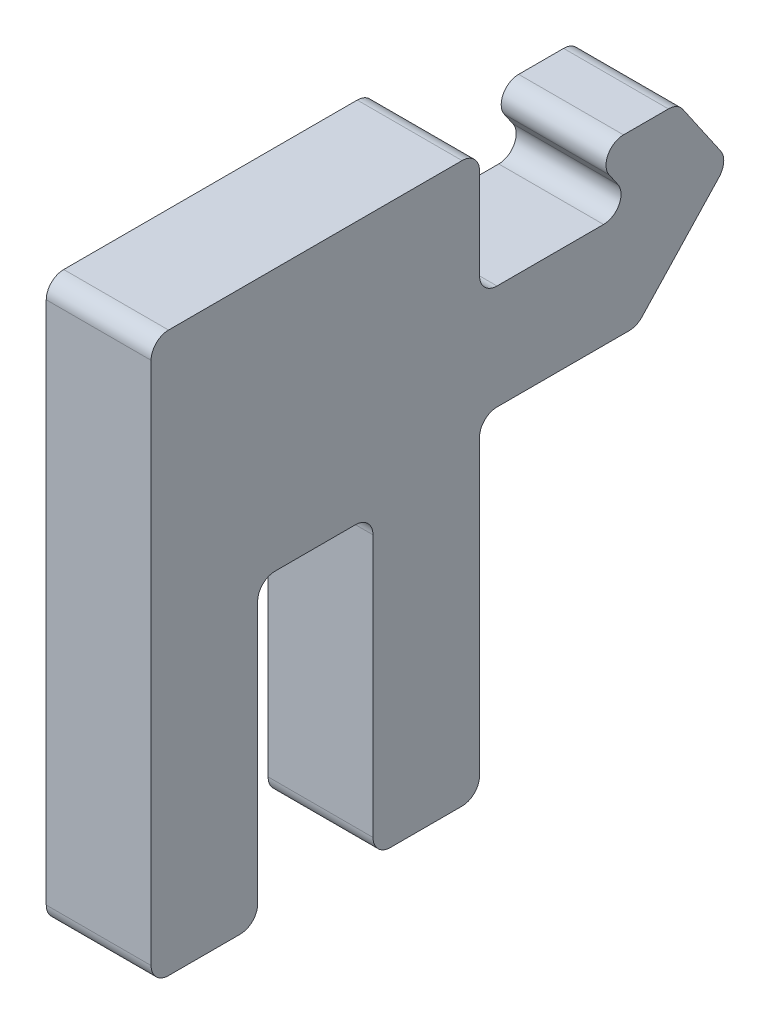
ISO-10303-21;
HEADER;
FILE_DESCRIPTION(('STEP AP214'),'2;1');
FILE_NAME('part.step','',(''),(''),'','','');
FILE_SCHEMA(('AUTOMOTIVE_DESIGN { 1 0 10303 214 1 1 1 1 }'));
ENDSEC;
DATA;
#1=APPLICATION_CONTEXT('core data for automotive mechanical design processes');
#2=APPLICATION_PROTOCOL_DEFINITION('international standard','automotive_design',2000,#1);
#3=PRODUCT_CONTEXT('',#1,'mechanical');
#4=PRODUCT('Part','Part','',(#3));
#5=PRODUCT_RELATED_PRODUCT_CATEGORY('part','',(#4));
#6=PRODUCT_DEFINITION_FORMATION('','',#4);
#7=PRODUCT_DEFINITION_CONTEXT('part definition',#1,'design');
#8=PRODUCT_DEFINITION('design','',#6,#7);
#9=PRODUCT_DEFINITION_SHAPE('','',#8);
#10=(LENGTH_UNIT() NAMED_UNIT(*) SI_UNIT(.MILLI.,.METRE.));
#11=(NAMED_UNIT(*) PLANE_ANGLE_UNIT() SI_UNIT($,.RADIAN.));
#12=(NAMED_UNIT(*) SI_UNIT($,.STERADIAN.) SOLID_ANGLE_UNIT());
#13=UNCERTAINTY_MEASURE_WITH_UNIT(LENGTH_MEASURE(1.E-05),#10,'distance_accuracy_value','');
#14=(GEOMETRIC_REPRESENTATION_CONTEXT(3) GLOBAL_UNCERTAINTY_ASSIGNED_CONTEXT((#13)) GLOBAL_UNIT_ASSIGNED_CONTEXT((#10,
#11,#12)) REPRESENTATION_CONTEXT('',''));
#15=CARTESIAN_POINT('',(0.,0.,0.));
#16=DIRECTION('',(0.,0.,1.));
#17=DIRECTION('',(1.,0.,0.));
#18=AXIS2_PLACEMENT_3D('',#15,#16,#17);
#19=CARTESIAN_POINT('',(3.,8.,-4.7));
#20=DIRECTION('',(0.,0.,1.));
#21=DIRECTION('',(0.,-1.,0.));
#22=AXIS2_PLACEMENT_3D('',#19,#20,#21);
#23=PLANE('',#22);
#24=DIRECTION('',(0.,1.,0.));
#25=VECTOR('',#24,1.);
#26=CARTESIAN_POINT('',(3.,8.,-4.7));
#27=LINE('',#26,#25);
#28=CARTESIAN_POINT('',(3.,4.89179828626601,-4.7));
#29=VERTEX_POINT('',#28);
#30=CARTESIAN_POINT('',(3.,7.5,-4.7));
#31=VERTEX_POINT('',#30);
#32=EDGE_CURVE('E430',#29,#31,#27,.T.);
#33=ORIENTED_EDGE('',*,*,#32,.F.);
#34=DIRECTION('',(1.,0.,0.));
#35=VECTOR('',#34,1.);
#36=CARTESIAN_POINT('',(3.,4.89179828626601,-4.7));
#37=LINE('',#36,#35);
#38=CARTESIAN_POINT('',(0.,4.89179828626601,-4.7));
#39=VERTEX_POINT('',#38);
#40=EDGE_CURVE('E322',#29,#39,#37,.F.);
#41=ORIENTED_EDGE('',*,*,#40,.T.);
#42=DIRECTION('',(0.,1.,0.));
#43=VECTOR('',#42,1.);
#44=CARTESIAN_POINT('',(0.,8.,-4.7));
#45=LINE('',#44,#43);
#46=CARTESIAN_POINT('',(0.,7.5,-4.7));
#47=VERTEX_POINT('',#46);
#48=EDGE_CURVE('E440',#39,#47,#45,.T.);
#49=ORIENTED_EDGE('',*,*,#48,.T.);
#50=DIRECTION('',(-1.,0.,0.));
#51=VECTOR('',#50,1.);
#52=CARTESIAN_POINT('',(3.,7.5,-4.7));
#53=LINE('',#52,#51);
#54=EDGE_CURVE('E320',#47,#31,#53,.F.);
#55=ORIENTED_EDGE('',*,*,#54,.T.);
#56=EDGE_LOOP('',(#33,#41,#49,#55));
#57=FACE_BOUND('',#56,.T.);
#58=ADVANCED_FACE('F37',(#57),#23,.F.);
#59=CARTESIAN_POINT('',(3.,-8.,4.7));
#60=DIRECTION('',(0.,1.,0.));
#61=DIRECTION('',(0.,0.,1.));
#62=AXIS2_PLACEMENT_3D('',#59,#60,#61);
#63=PLANE('',#62);
#64=DIRECTION('',(0.,0.,-1.));
#65=VECTOR('',#64,1.);
#66=CARTESIAN_POINT('',(0.,-8.,4.7));
#67=LINE('',#66,#65);
#68=CARTESIAN_POINT('',(0.,-8.,4.2));
#69=VERTEX_POINT('',#68);
#70=CARTESIAN_POINT('',(0.,-8.,2.15));
#71=VERTEX_POINT('',#70);
#72=EDGE_CURVE('E437',#69,#71,#67,.T.);
#73=ORIENTED_EDGE('',*,*,#72,.T.);
#74=DIRECTION('',(1.,0.,0.));
#75=VECTOR('',#74,1.);
#76=CARTESIAN_POINT('',(3.,-8.,2.15));
#77=LINE('',#76,#75);
#78=CARTESIAN_POINT('',(3.,-8.,2.15));
#79=VERTEX_POINT('',#78);
#80=EDGE_CURVE('E368',#71,#79,#77,.T.);
#81=ORIENTED_EDGE('',*,*,#80,.T.);
#82=DIRECTION('',(0.,0.,-1.));
#83=VECTOR('',#82,1.);
#84=CARTESIAN_POINT('',(3.,-8.,4.7));
#85=LINE('',#84,#83);
#86=CARTESIAN_POINT('',(3.,-8.,4.2));
#87=VERTEX_POINT('',#86);
#88=EDGE_CURVE('E428',#87,#79,#85,.T.);
#89=ORIENTED_EDGE('',*,*,#88,.F.);
#90=DIRECTION('',(-1.,0.,0.));
#91=VECTOR('',#90,1.);
#92=CARTESIAN_POINT('',(3.,-8.,4.2));
#93=LINE('',#92,#91);
#94=EDGE_CURVE('E365',#87,#69,#93,.T.);
#95=ORIENTED_EDGE('',*,*,#94,.T.);
#96=EDGE_LOOP('',(#73,#81,#89,#95));
#97=FACE_BOUND('',#96,.T.);
#98=ADVANCED_FACE('F462',(#97),#63,.F.);
#99=CARTESIAN_POINT('',(3.,8.,4.7));
#100=DIRECTION('',(0.,0.,-1.));
#101=DIRECTION('',(0.,1.,0.));
#102=AXIS2_PLACEMENT_3D('',#99,#100,#101);
#103=PLANE('',#102);
#104=DIRECTION('',(0.,-1.,0.));
#105=VECTOR('',#104,1.);
#106=CARTESIAN_POINT('',(3.,8.,4.7));
#107=LINE('',#106,#105);
#108=CARTESIAN_POINT('',(3.,7.5,4.7));
#109=VERTEX_POINT('',#108);
#110=CARTESIAN_POINT('',(3.,-7.5,4.7));
#111=VERTEX_POINT('',#110);
#112=EDGE_CURVE('E424',#109,#111,#107,.T.);
#113=ORIENTED_EDGE('',*,*,#112,.F.);
#114=DIRECTION('',(-1.,0.,0.));
#115=VECTOR('',#114,1.);
#116=CARTESIAN_POINT('',(3.,7.5,4.7));
#117=LINE('',#116,#115);
#118=CARTESIAN_POINT('',(0.,7.5,4.7));
#119=VERTEX_POINT('',#118);
#120=EDGE_CURVE('E274',#109,#119,#117,.T.);
#121=ORIENTED_EDGE('',*,*,#120,.T.);
#122=DIRECTION('',(0.,-1.,0.));
#123=VECTOR('',#122,1.);
#124=CARTESIAN_POINT('',(0.,8.,4.7));
#125=LINE('',#124,#123);
#126=CARTESIAN_POINT('',(0.,-7.5,4.7));
#127=VERTEX_POINT('',#126);
#128=EDGE_CURVE('E413',#119,#127,#125,.T.);
#129=ORIENTED_EDGE('',*,*,#128,.T.);
#130=DIRECTION('',(-1.,0.,0.));
#131=VECTOR('',#130,1.);
#132=CARTESIAN_POINT('',(3.,-7.5,4.7));
#133=LINE('',#132,#131);
#134=EDGE_CURVE('E272',#127,#111,#133,.F.);
#135=ORIENTED_EDGE('',*,*,#134,.T.);
#136=EDGE_LOOP('',(#113,#121,#129,#135));
#137=FACE_BOUND('',#136,.T.);
#138=ADVANCED_FACE('F454',(#137),#103,.F.);
#139=CARTESIAN_POINT('',(0.,-8.,-2.15));
#140=VERTEX_POINT('',#139);
#141=CARTESIAN_POINT('',(0.,-8.,-4.2));
#142=VERTEX_POINT('',#141);
#143=EDGE_CURVE('E416',#140,#142,#67,.T.);
#144=ORIENTED_EDGE('',*,*,#143,.T.);
#145=DIRECTION('',(-1.,0.,0.));
#146=VECTOR('',#145,1.);
#147=CARTESIAN_POINT('',(3.,-8.,-4.2));
#148=LINE('',#147,#146);
#149=CARTESIAN_POINT('',(3.,-8.,-4.2));
#150=VERTEX_POINT('',#149);
#151=EDGE_CURVE('E372',#142,#150,#148,.F.);
#152=ORIENTED_EDGE('',*,*,#151,.T.);
#153=CARTESIAN_POINT('',(3.,-8.,-2.15));
#154=VERTEX_POINT('',#153);
#155=EDGE_CURVE('E426',#154,#150,#85,.T.);
#156=ORIENTED_EDGE('',*,*,#155,.F.);
#157=DIRECTION('',(1.,0.,0.));
#158=VECTOR('',#157,1.);
#159=CARTESIAN_POINT('',(3.,-8.,-2.15));
#160=LINE('',#159,#158);
#161=EDGE_CURVE('E370',#154,#140,#160,.F.);
#162=ORIENTED_EDGE('',*,*,#161,.T.);
#163=EDGE_LOOP('',(#144,#152,#156,#162));
#164=FACE_BOUND('',#163,.T.);
#165=ADVANCED_FACE('F514',(#164),#63,.F.);
#166=CARTESIAN_POINT('',(0.,-7.5,-4.7));
#167=VERTEX_POINT('',#166);
#168=CARTESIAN_POINT('',(0.,0.89179828626601,-4.7));
#169=VERTEX_POINT('',#168);
#170=EDGE_CURVE('E438',#167,#169,#45,.T.);
#171=ORIENTED_EDGE('',*,*,#170,.T.);
#172=DIRECTION('',(1.,0.,0.));
#173=VECTOR('',#172,1.);
#174=CARTESIAN_POINT('',(3.,0.89179828626601,-4.7));
#175=LINE('',#174,#173);
#176=CARTESIAN_POINT('',(3.,0.89179828626601,-4.7));
#177=VERTEX_POINT('',#176);
#178=EDGE_CURVE('E347',#169,#177,#175,.T.);
#179=ORIENTED_EDGE('',*,*,#178,.T.);
#180=CARTESIAN_POINT('',(3.,-7.5,-4.7));
#181=VERTEX_POINT('',#180);
#182=EDGE_CURVE('E433',#181,#177,#27,.T.);
#183=ORIENTED_EDGE('',*,*,#182,.F.);
#184=DIRECTION('',(-1.,0.,0.));
#185=VECTOR('',#184,1.);
#186=CARTESIAN_POINT('',(3.,-7.5,-4.7));
#187=LINE('',#186,#185);
#188=EDGE_CURVE('E344',#181,#167,#187,.T.);
#189=ORIENTED_EDGE('',*,*,#188,.T.);
#190=EDGE_LOOP('',(#171,#179,#183,#189));
#191=FACE_BOUND('',#190,.T.);
#192=ADVANCED_FACE('F523',(#191),#23,.F.);
#193=CARTESIAN_POINT('',(3.,8.,4.7));
#194=DIRECTION('',(0.,-1.,0.));
#195=DIRECTION('',(0.,0.,-1.));
#196=AXIS2_PLACEMENT_3D('',#193,#194,#195);
#197=PLANE('',#196);
#198=DIRECTION('',(0.,0.,1.));
#199=VECTOR('',#198,1.);
#200=CARTESIAN_POINT('',(0.,8.,4.7));
#201=LINE('',#200,#199);
#202=CARTESIAN_POINT('',(0.,8.,-4.2));
#203=VERTEX_POINT('',#202);
#204=CARTESIAN_POINT('',(0.,8.,4.2));
#205=VERTEX_POINT('',#204);
#206=EDGE_CURVE('E427',#203,#205,#201,.T.);
#207=ORIENTED_EDGE('',*,*,#206,.T.);
#208=DIRECTION('',(-1.,0.,0.));
#209=VECTOR('',#208,1.);
#210=CARTESIAN_POINT('',(3.,8.,4.2));
#211=LINE('',#210,#209);
#212=CARTESIAN_POINT('',(3.,8.,4.2));
#213=VERTEX_POINT('',#212);
#214=EDGE_CURVE('E300',#205,#213,#211,.F.);
#215=ORIENTED_EDGE('',*,*,#214,.T.);
#216=DIRECTION('',(0.,0.,1.));
#217=VECTOR('',#216,1.);
#218=CARTESIAN_POINT('',(3.,8.,4.7));
#219=LINE('',#218,#217);
#220=CARTESIAN_POINT('',(3.,8.,-4.2));
#221=VERTEX_POINT('',#220);
#222=EDGE_CURVE('E267',#221,#213,#219,.T.);
#223=ORIENTED_EDGE('',*,*,#222,.F.);
#224=DIRECTION('',(-1.,0.,0.));
#225=VECTOR('',#224,1.);
#226=CARTESIAN_POINT('',(3.,8.,-4.2));
#227=LINE('',#226,#225);
#228=EDGE_CURVE('E297',#221,#203,#227,.T.);
#229=ORIENTED_EDGE('',*,*,#228,.T.);
#230=EDGE_LOOP('',(#207,#215,#223,#229));
#231=FACE_BOUND('',#230,.T.);
#232=ADVANCED_FACE('F445',(#231),#197,.F.);
#233=CARTESIAN_POINT('',(3.,0.,0.));
#234=DIRECTION('',(1.,0.,0.));
#235=DIRECTION('',(0.,0.,-1.));
#236=AXIS2_PLACEMENT_3D('',#233,#234,#235);
#237=PLANE('',#236);
#238=ORIENTED_EDGE('',*,*,#222,.T.);
#239=CARTESIAN_POINT('',(3.,7.5,4.2));
#240=DIRECTION('',(1.,0.,0.));
#241=DIRECTION('',(0.,0.,-1.));
#242=AXIS2_PLACEMENT_3D('',#239,#240,#241);
#243=CIRCLE('',#242,0.5);
#244=EDGE_CURVE('E318',#213,#109,#243,.T.);
#245=ORIENTED_EDGE('',*,*,#244,.T.);
#246=ORIENTED_EDGE('',*,*,#112,.T.);
#247=CARTESIAN_POINT('',(3.,-7.5,4.2));
#248=DIRECTION('',(1.,0.,0.));
#249=DIRECTION('',(0.,0.,-1.));
#250=AXIS2_PLACEMENT_3D('',#247,#248,#249);
#251=CIRCLE('',#250,0.5);
#252=EDGE_CURVE('E60',#111,#87,#251,.T.);
#253=ORIENTED_EDGE('',*,*,#252,.T.);
#254=ORIENTED_EDGE('',*,*,#88,.T.);
#255=CARTESIAN_POINT('',(3.,-7.5,2.15));
#256=DIRECTION('',(1.,0.,0.));
#257=DIRECTION('',(0.,0.,-1.));
#258=AXIS2_PLACEMENT_3D('',#255,#256,#257);
#259=CIRCLE('',#258,0.5);
#260=CARTESIAN_POINT('',(3.,-7.5,1.65));
#261=VERTEX_POINT('',#260);
#262=EDGE_CURVE('E52',#79,#261,#259,.T.);
#263=ORIENTED_EDGE('',*,*,#262,.T.);
#264=DIRECTION('',(0.,-1.,0.));
#265=VECTOR('',#264,1.);
#266=CARTESIAN_POINT('',(3.,-8.,1.65));
#267=LINE('',#266,#265);
#268=CARTESIAN_POINT('',(3.,0.,1.65));
#269=VERTEX_POINT('',#268);
#270=EDGE_CURVE('E392',#269,#261,#267,.T.);
#271=ORIENTED_EDGE('',*,*,#270,.F.);
#272=CARTESIAN_POINT('',(3.,0.,1.15));
#273=DIRECTION('',(1.,0.,0.));
#274=DIRECTION('',(0.,0.,-1.));
#275=AXIS2_PLACEMENT_3D('',#272,#273,#274);
#276=CIRCLE('',#275,0.5);
#277=CARTESIAN_POINT('',(3.,0.500000000000001,1.15));
#278=VERTEX_POINT('',#277);
#279=EDGE_CURVE('E45',#269,#278,#276,.F.);
#280=ORIENTED_EDGE('',*,*,#279,.T.);
#281=DIRECTION('',(0.,0.,1.));
#282=VECTOR('',#281,1.);
#283=CARTESIAN_POINT('',(3.,0.5,1.65));
#284=LINE('',#283,#282);
#285=CARTESIAN_POINT('',(3.,0.500000000000001,-1.15));
#286=VERTEX_POINT('',#285);
#287=EDGE_CURVE('E390',#286,#278,#284,.T.);
#288=ORIENTED_EDGE('',*,*,#287,.F.);
#289=CARTESIAN_POINT('',(3.,0.,-1.15));
#290=DIRECTION('',(1.,0.,0.));
#291=DIRECTION('',(0.,0.,-1.));
#292=AXIS2_PLACEMENT_3D('',#289,#290,#291);
#293=CIRCLE('',#292,0.5);
#294=CARTESIAN_POINT('',(3.,0.,-1.65));
#295=VERTEX_POINT('',#294);
#296=EDGE_CURVE('E382',#286,#295,#293,.F.);
#297=ORIENTED_EDGE('',*,*,#296,.T.);
#298=DIRECTION('',(0.,1.,0.));
#299=VECTOR('',#298,1.);
#300=CARTESIAN_POINT('',(3.,-8.,-1.65));
#301=LINE('',#300,#299);
#302=CARTESIAN_POINT('',(3.,-7.5,-1.65));
#303=VERTEX_POINT('',#302);
#304=EDGE_CURVE('E402',#303,#295,#301,.T.);
#305=ORIENTED_EDGE('',*,*,#304,.F.);
#306=CARTESIAN_POINT('',(3.,-7.5,-2.15));
#307=DIRECTION('',(1.,0.,0.));
#308=DIRECTION('',(0.,0.,-1.));
#309=AXIS2_PLACEMENT_3D('',#306,#307,#308);
#310=CIRCLE('',#309,0.5);
#311=EDGE_CURVE('E302',#303,#154,#310,.T.);
#312=ORIENTED_EDGE('',*,*,#311,.T.);
#313=ORIENTED_EDGE('',*,*,#155,.T.);
#314=CARTESIAN_POINT('',(3.,-7.5,-4.2));
#315=DIRECTION('',(1.,0.,0.));
#316=DIRECTION('',(0.,0.,-1.));
#317=AXIS2_PLACEMENT_3D('',#314,#315,#316);
#318=CIRCLE('',#317,0.5);
#319=EDGE_CURVE('E304',#150,#181,#318,.T.);
#320=ORIENTED_EDGE('',*,*,#319,.T.);
#321=ORIENTED_EDGE('',*,*,#182,.T.);
#322=CARTESIAN_POINT('',(3.,0.89179828626601,-5.2));
#323=DIRECTION('',(1.,0.,0.));
#324=DIRECTION('',(0.,0.,-1.));
#325=AXIS2_PLACEMENT_3D('',#322,#323,#324);
#326=CIRCLE('',#325,0.5);
#327=CARTESIAN_POINT('',(3.,1.39179828626601,-5.2));
#328=VERTEX_POINT('',#327);
#329=EDGE_CURVE('E378',#177,#328,#326,.F.);
#330=ORIENTED_EDGE('',*,*,#329,.T.);
#331=DIRECTION('',(0.,0.,-1.));
#332=VECTOR('',#331,1.);
#333=CARTESIAN_POINT('',(3.,1.39179828626601,-4.7));
#334=LINE('',#333,#332);
#335=CARTESIAN_POINT('',(3.,1.39179828626601,-8.98292142650266));
#336=VERTEX_POINT('',#335);
#337=EDGE_CURVE('E485',#328,#336,#334,.T.);
#338=ORIENTED_EDGE('',*,*,#337,.T.);
#339=CARTESIAN_POINT('',(3.,1.89179828626601,-8.98292142650266));
#340=DIRECTION('',(1.,0.,0.));
#341=DIRECTION('',(0.,0.,-1.));
#342=AXIS2_PLACEMENT_3D('',#339,#340,#341);
#343=CIRCLE('',#342,0.5);
#344=CARTESIAN_POINT('',(3.,1.55039620729636,-9.34822215258352));
#345=VERTEX_POINT('',#344);
#346=EDGE_CURVE('E308',#336,#345,#343,.T.);
#347=ORIENTED_EDGE('',*,*,#346,.T.);
#348=DIRECTION('',(0.,0.730601452161709,-0.682804157939303));
#349=VECTOR('',#348,1.);
#350=CARTESIAN_POINT('',(3.,4.20455804615637,-11.8287438296966));
#351=LINE('',#350,#349);
#352=CARTESIAN_POINT('',(3.,3.91097969384452,-11.5543719145487));
#353=VERTEX_POINT('',#352);
#354=EDGE_CURVE('E488',#345,#353,#351,.T.);
#355=ORIENTED_EDGE('',*,*,#354,.T.);
#356=CARTESIAN_POINT('',(3.,4.25238177281417,-11.1890711884678));
#357=DIRECTION('',(1.,0.,0.));
#358=DIRECTION('',(0.,0.,-1.));
#359=AXIS2_PLACEMENT_3D('',#356,#357,#358);
#360=CIRCLE('',#359,0.5);
#361=CARTESIAN_POINT('',(3.,4.53567033653108,-11.601075544837));
#362=VERTEX_POINT('',#361);
#363=EDGE_CURVE('E310',#353,#362,#360,.T.);
#364=ORIENTED_EDGE('',*,*,#363,.T.);
#365=DIRECTION('',(0.,0.824008712738433,0.566577127433812));
#366=VECTOR('',#365,1.);
#367=CARTESIAN_POINT('',(3.,6.32740146716744,-10.3691057107366));
#368=LINE('',#367,#366);
#369=CARTESIAN_POINT('',(3.,6.11069003088435,-10.5181135320778));
#370=VERTEX_POINT('',#369);
#371=EDGE_CURVE('E491',#362,#370,#368,.T.);
#372=ORIENTED_EDGE('',*,*,#371,.T.);
#373=CARTESIAN_POINT('',(3.,5.82740146716744,-10.1061091757086));
#374=DIRECTION('',(1.,0.,0.));
#375=DIRECTION('',(0.,0.,-1.));
#376=AXIS2_PLACEMENT_3D('',#373,#374,#375);
#377=CIRCLE('',#376,0.5);
#378=CARTESIAN_POINT('',(3.,6.32740146716744,-10.1061091757086));
#379=VERTEX_POINT('',#378);
#380=EDGE_CURVE('E312',#370,#379,#377,.T.);
#381=ORIENTED_EDGE('',*,*,#380,.T.);
#382=DIRECTION('',(0.,0.,1.));
#383=VECTOR('',#382,1.);
#384=CARTESIAN_POINT('',(3.,6.32740146716744,-7.86910571073658));
#385=LINE('',#384,#383);
#386=CARTESIAN_POINT('',(3.,6.32740146716744,-8.81968857667958));
#387=VERTEX_POINT('',#386);
#388=EDGE_CURVE('E494',#379,#387,#385,.T.);
#389=ORIENTED_EDGE('',*,*,#388,.T.);
#390=CARTESIAN_POINT('',(3.,5.82740146716744,-8.81968857667958));
#391=DIRECTION('',(1.,0.,0.));
#392=DIRECTION('',(0.,0.,-1.));
#393=AXIS2_PLACEMENT_3D('',#390,#391,#392);
#394=CIRCLE('',#393,0.5);
#395=CARTESIAN_POINT('',(3.,5.54411290345053,-8.40768422031037));
#396=VERTEX_POINT('',#395);
#397=EDGE_CURVE('E314',#387,#396,#394,.T.);
#398=ORIENTED_EDGE('',*,*,#397,.T.);
#399=DIRECTION('',(0.,-0.824008712738433,-0.566577127433813));
#400=VECTOR('',#399,1.);
#401=CARTESIAN_POINT('',(3.,6.32740146716744,-7.86910571073658));
#402=LINE('',#401,#400);
#403=CARTESIAN_POINT('',(3.,5.17508684998292,-8.66142149042621));
#404=VERTEX_POINT('',#403);
#405=EDGE_CURVE('E497',#396,#404,#402,.T.);
#406=ORIENTED_EDGE('',*,*,#405,.T.);
#407=CARTESIAN_POINT('',(3.,4.89179828626601,-8.249417134057));
#408=DIRECTION('',(1.,0.,0.));
#409=DIRECTION('',(0.,0.,-1.));
#410=AXIS2_PLACEMENT_3D('',#407,#408,#409);
#411=CIRCLE('',#410,0.5);
#412=CARTESIAN_POINT('',(3.,4.39179828626601,-8.249417134057));
#413=VERTEX_POINT('',#412);
#414=EDGE_CURVE('E249',#404,#413,#411,.F.);
#415=ORIENTED_EDGE('',*,*,#414,.T.);
#416=DIRECTION('',(0.,0.,1.));
#417=VECTOR('',#416,1.);
#418=CARTESIAN_POINT('',(3.,4.39179828626601,-9.2));
#419=LINE('',#418,#417);
#420=CARTESIAN_POINT('',(3.,4.39179828626601,-5.2));
#421=VERTEX_POINT('',#420);
#422=EDGE_CURVE('E483',#413,#421,#419,.T.);
#423=ORIENTED_EDGE('',*,*,#422,.T.);
#424=CARTESIAN_POINT('',(3.,4.89179828626601,-5.2));
#425=DIRECTION('',(1.,0.,0.));
#426=DIRECTION('',(0.,0.,-1.));
#427=AXIS2_PLACEMENT_3D('',#424,#425,#426);
#428=CIRCLE('',#427,0.5);
#429=EDGE_CURVE('E248',#421,#29,#428,.F.);
#430=ORIENTED_EDGE('',*,*,#429,.T.);
#431=ORIENTED_EDGE('',*,*,#32,.T.);
#432=CARTESIAN_POINT('',(3.,7.5,-4.2));
#433=DIRECTION('',(1.,0.,0.));
#434=DIRECTION('',(0.,0.,-1.));
#435=AXIS2_PLACEMENT_3D('',#432,#433,#434);
#436=CIRCLE('',#435,0.5);
#437=EDGE_CURVE('E316',#31,#221,#436,.T.);
#438=ORIENTED_EDGE('',*,*,#437,.T.);
#439=EDGE_LOOP('',(#238,#245,#246,#253,#254,#263,#271,#280,#288,#297,#305,#312,#313,#320,#321,
#330,#338,#347,#355,#364,#372,#381,#389,#398,#406,#415,#423,#430,#431,#438));
#440=FACE_BOUND('',#439,.T.);
#441=ADVANCED_FACE('F389',(#440),#237,.T.);
#442=CARTESIAN_POINT('',(0.,0.,0.));
#443=DIRECTION('',(1.,0.,0.));
#444=DIRECTION('',(0.,0.,-1.));
#445=AXIS2_PLACEMENT_3D('',#442,#443,#444);
#446=PLANE('',#445);
#447=ORIENTED_EDGE('',*,*,#128,.F.);
#448=CARTESIAN_POINT('',(0.,7.5,4.2));
#449=DIRECTION('',(1.,0.,0.));
#450=DIRECTION('',(0.,0.,-1.));
#451=AXIS2_PLACEMENT_3D('',#448,#449,#450);
#452=CIRCLE('',#451,0.5);
#453=EDGE_CURVE('E295',#119,#205,#452,.F.);
#454=ORIENTED_EDGE('',*,*,#453,.T.);
#455=ORIENTED_EDGE('',*,*,#206,.F.);
#456=CARTESIAN_POINT('',(0.,7.5,-4.2));
#457=DIRECTION('',(1.,0.,0.));
#458=DIRECTION('',(0.,0.,-1.));
#459=AXIS2_PLACEMENT_3D('',#456,#457,#458);
#460=CIRCLE('',#459,0.5);
#461=EDGE_CURVE('E293',#203,#47,#460,.F.);
#462=ORIENTED_EDGE('',*,*,#461,.T.);
#463=ORIENTED_EDGE('',*,*,#48,.F.);
#464=CARTESIAN_POINT('',(0.,4.89179828626601,-5.2));
#465=DIRECTION('',(1.,0.,0.));
#466=DIRECTION('',(0.,0.,-1.));
#467=AXIS2_PLACEMENT_3D('',#464,#465,#466);
#468=CIRCLE('',#467,0.5);
#469=CARTESIAN_POINT('',(0.,4.39179828626601,-5.2));
#470=VERTEX_POINT('',#469);
#471=EDGE_CURVE('E376',#39,#470,#468,.T.);
#472=ORIENTED_EDGE('',*,*,#471,.T.);
#473=DIRECTION('',(0.,0.,-1.));
#474=VECTOR('',#473,1.);
#475=CARTESIAN_POINT('',(0.,4.39179828626601,-9.2));
#476=LINE('',#475,#474);
#477=CARTESIAN_POINT('',(0.,4.39179828626601,-8.249417134057));
#478=VERTEX_POINT('',#477);
#479=EDGE_CURVE('E244',#470,#478,#476,.T.);
#480=ORIENTED_EDGE('',*,*,#479,.T.);
#481=CARTESIAN_POINT('',(0.,4.89179828626601,-8.249417134057));
#482=DIRECTION('',(1.,0.,0.));
#483=DIRECTION('',(0.,0.,-1.));
#484=AXIS2_PLACEMENT_3D('',#481,#482,#483);
#485=CIRCLE('',#484,0.5);
#486=CARTESIAN_POINT('',(0.,5.17508684998292,-8.66142149042621));
#487=VERTEX_POINT('',#486);
#488=EDGE_CURVE('E237',#478,#487,#485,.T.);
#489=ORIENTED_EDGE('',*,*,#488,.T.);
#490=DIRECTION('',(0.,0.824008712738433,0.566577127433813));
#491=VECTOR('',#490,1.);
#492=CARTESIAN_POINT('',(0.,6.32740146716744,-7.86910571073658));
#493=LINE('',#492,#491);
#494=CARTESIAN_POINT('',(0.,5.54411290345053,-8.40768422031037));
#495=VERTEX_POINT('',#494);
#496=EDGE_CURVE('E241',#487,#495,#493,.T.);
#497=ORIENTED_EDGE('',*,*,#496,.T.);
#498=CARTESIAN_POINT('',(0.,5.82740146716744,-8.81968857667958));
#499=DIRECTION('',(1.,0.,0.));
#500=DIRECTION('',(0.,0.,-1.));
#501=AXIS2_PLACEMENT_3D('',#498,#499,#500);
#502=CIRCLE('',#501,0.5);
#503=CARTESIAN_POINT('',(0.,6.32740146716744,-8.81968857667958));
#504=VERTEX_POINT('',#503);
#505=EDGE_CURVE('E291',#495,#504,#502,.F.);
#506=ORIENTED_EDGE('',*,*,#505,.T.);
#507=DIRECTION('',(0.,0.,-1.));
#508=VECTOR('',#507,1.);
#509=CARTESIAN_POINT('',(0.,6.32740146716744,-7.86910571073658));
#510=LINE('',#509,#508);
#511=CARTESIAN_POINT('',(0.,6.32740146716744,-10.1061091757086));
#512=VERTEX_POINT('',#511);
#513=EDGE_CURVE('E259',#504,#512,#510,.T.);
#514=ORIENTED_EDGE('',*,*,#513,.T.);
#515=CARTESIAN_POINT('',(0.,5.82740146716744,-10.1061091757086));
#516=DIRECTION('',(1.,0.,0.));
#517=DIRECTION('',(0.,0.,-1.));
#518=AXIS2_PLACEMENT_3D('',#515,#516,#517);
#519=CIRCLE('',#518,0.5);
#520=CARTESIAN_POINT('',(0.,6.11069003088435,-10.5181135320778));
#521=VERTEX_POINT('',#520);
#522=EDGE_CURVE('E289',#512,#521,#519,.F.);
#523=ORIENTED_EDGE('',*,*,#522,.T.);
#524=DIRECTION('',(0.,-0.824008712738433,-0.566577127433812));
#525=VECTOR('',#524,1.);
#526=CARTESIAN_POINT('',(0.,6.32740146716744,-10.3691057107366));
#527=LINE('',#526,#525);
#528=CARTESIAN_POINT('',(0.,4.53567033653108,-11.601075544837));
#529=VERTEX_POINT('',#528);
#530=EDGE_CURVE('E557',#521,#529,#527,.T.);
#531=ORIENTED_EDGE('',*,*,#530,.T.);
#532=CARTESIAN_POINT('',(0.,4.25238177281417,-11.1890711884678));
#533=DIRECTION('',(1.,0.,0.));
#534=DIRECTION('',(0.,0.,-1.));
#535=AXIS2_PLACEMENT_3D('',#532,#533,#534);
#536=CIRCLE('',#535,0.5);
#537=CARTESIAN_POINT('',(0.,3.91097969384452,-11.5543719145487));
#538=VERTEX_POINT('',#537);
#539=EDGE_CURVE('E287',#529,#538,#536,.F.);
#540=ORIENTED_EDGE('',*,*,#539,.T.);
#541=DIRECTION('',(0.,-0.73060145216171,0.682804157939303));
#542=VECTOR('',#541,1.);
#543=CARTESIAN_POINT('',(0.,4.20455804615637,-11.8287438296966));
#544=LINE('',#543,#542);
#545=CARTESIAN_POINT('',(0.,1.55039620729636,-9.34822215258352));
#546=VERTEX_POINT('',#545);
#547=EDGE_CURVE('E546',#538,#546,#544,.T.);
#548=ORIENTED_EDGE('',*,*,#547,.T.);
#549=CARTESIAN_POINT('',(0.,1.89179828626601,-8.98292142650266));
#550=DIRECTION('',(1.,0.,0.));
#551=DIRECTION('',(0.,0.,-1.));
#552=AXIS2_PLACEMENT_3D('',#549,#550,#551);
#553=CIRCLE('',#552,0.5);
#554=CARTESIAN_POINT('',(0.,1.39179828626601,-8.98292142650266));
#555=VERTEX_POINT('',#554);
#556=EDGE_CURVE('E285',#546,#555,#553,.F.);
#557=ORIENTED_EDGE('',*,*,#556,.T.);
#558=DIRECTION('',(0.,0.,1.));
#559=VECTOR('',#558,1.);
#560=CARTESIAN_POINT('',(0.,1.39179828626601,-4.7));
#561=LINE('',#560,#559);
#562=CARTESIAN_POINT('',(0.,1.39179828626601,-5.2));
#563=VERTEX_POINT('',#562);
#564=EDGE_CURVE('E498',#555,#563,#561,.T.);
#565=ORIENTED_EDGE('',*,*,#564,.T.);
#566=CARTESIAN_POINT('',(0.,0.89179828626601,-5.2));
#567=DIRECTION('',(1.,0.,0.));
#568=DIRECTION('',(0.,0.,-1.));
#569=AXIS2_PLACEMENT_3D('',#566,#567,#568);
#570=CIRCLE('',#569,0.5);
#571=EDGE_CURVE('E380',#563,#169,#570,.T.);
#572=ORIENTED_EDGE('',*,*,#571,.T.);
#573=ORIENTED_EDGE('',*,*,#170,.F.);
#574=CARTESIAN_POINT('',(0.,-7.5,-4.2));
#575=DIRECTION('',(1.,0.,0.));
#576=DIRECTION('',(0.,0.,-1.));
#577=AXIS2_PLACEMENT_3D('',#574,#575,#576);
#578=CIRCLE('',#577,0.5);
#579=EDGE_CURVE('E279',#167,#142,#578,.F.);
#580=ORIENTED_EDGE('',*,*,#579,.T.);
#581=ORIENTED_EDGE('',*,*,#143,.F.);
#582=CARTESIAN_POINT('',(0.,-7.5,-2.15));
#583=DIRECTION('',(1.,0.,0.));
#584=DIRECTION('',(0.,0.,-1.));
#585=AXIS2_PLACEMENT_3D('',#582,#583,#584);
#586=CIRCLE('',#585,0.5);
#587=CARTESIAN_POINT('',(0.,-7.5,-1.65));
#588=VERTEX_POINT('',#587);
#589=EDGE_CURVE('E277',#140,#588,#586,.F.);
#590=ORIENTED_EDGE('',*,*,#589,.T.);
#591=DIRECTION('',(0.,-1.,0.));
#592=VECTOR('',#591,1.);
#593=CARTESIAN_POINT('',(0.,-8.,-1.65));
#594=LINE('',#593,#592);
#595=CARTESIAN_POINT('',(0.,0.,-1.65));
#596=VERTEX_POINT('',#595);
#597=EDGE_CURVE('E401',#596,#588,#594,.T.);
#598=ORIENTED_EDGE('',*,*,#597,.F.);
#599=CARTESIAN_POINT('',(0.,0.,-1.15));
#600=DIRECTION('',(1.,0.,0.));
#601=DIRECTION('',(0.,0.,-1.));
#602=AXIS2_PLACEMENT_3D('',#599,#600,#601);
#603=CIRCLE('',#602,0.5);
#604=CARTESIAN_POINT('',(0.,0.500000000000001,-1.15));
#605=VERTEX_POINT('',#604);
#606=EDGE_CURVE('E384',#596,#605,#603,.T.);
#607=ORIENTED_EDGE('',*,*,#606,.T.);
#608=DIRECTION('',(0.,0.,-1.));
#609=VECTOR('',#608,1.);
#610=CARTESIAN_POINT('',(0.,0.5,1.65));
#611=LINE('',#610,#609);
#612=CARTESIAN_POINT('',(0.,0.500000000000001,1.15));
#613=VERTEX_POINT('',#612);
#614=EDGE_CURVE('E410',#613,#605,#611,.T.);
#615=ORIENTED_EDGE('',*,*,#614,.F.);
#616=CARTESIAN_POINT('',(0.,0.,1.15));
#617=DIRECTION('',(1.,0.,0.));
#618=DIRECTION('',(0.,0.,-1.));
#619=AXIS2_PLACEMENT_3D('',#616,#617,#618);
#620=CIRCLE('',#619,0.5);
#621=CARTESIAN_POINT('',(0.,0.,1.65));
#622=VERTEX_POINT('',#621);
#623=EDGE_CURVE('E11',#613,#622,#620,.T.);
#624=ORIENTED_EDGE('',*,*,#623,.T.);
#625=DIRECTION('',(0.,1.,0.));
#626=VECTOR('',#625,1.);
#627=CARTESIAN_POINT('',(0.,-8.,1.65));
#628=LINE('',#627,#626);
#629=CARTESIAN_POINT('',(0.,-7.5,1.65));
#630=VERTEX_POINT('',#629);
#631=EDGE_CURVE('E408',#630,#622,#628,.T.);
#632=ORIENTED_EDGE('',*,*,#631,.F.);
#633=CARTESIAN_POINT('',(0.,-7.5,2.15));
#634=DIRECTION('',(1.,0.,0.));
#635=DIRECTION('',(0.,0.,-1.));
#636=AXIS2_PLACEMENT_3D('',#633,#634,#635);
#637=CIRCLE('',#636,0.5);
#638=EDGE_CURVE('E283',#630,#71,#637,.F.);
#639=ORIENTED_EDGE('',*,*,#638,.T.);
#640=ORIENTED_EDGE('',*,*,#72,.F.);
#641=CARTESIAN_POINT('',(0.,-7.5,4.2));
#642=DIRECTION('',(1.,0.,0.));
#643=DIRECTION('',(0.,0.,-1.));
#644=AXIS2_PLACEMENT_3D('',#641,#642,#643);
#645=CIRCLE('',#644,0.5);
#646=EDGE_CURVE('E281',#69,#127,#645,.F.);
#647=ORIENTED_EDGE('',*,*,#646,.T.);
#648=EDGE_LOOP('',(#447,#454,#455,#462,#463,#472,#480,#489,#497,#506,#514,#523,#531,#540,#548,
#557,#565,#572,#573,#580,#581,#590,#598,#607,#615,#624,#632,#639,#640,#647));
#649=FACE_BOUND('',#648,.T.);
#650=ADVANCED_FACE('F240',(#649),#446,.F.);
#651=CARTESIAN_POINT('',(-9.1181138400439,-8.,1.65));
#652=DIRECTION('',(0.,0.,1.));
#653=DIRECTION('',(0.,-1.,0.));
#654=AXIS2_PLACEMENT_3D('',#651,#652,#653);
#655=PLANE('',#654);
#656=ORIENTED_EDGE('',*,*,#631,.T.);
#657=DIRECTION('',(1.,0.,0.));
#658=VECTOR('',#657,1.);
#659=CARTESIAN_POINT('',(3.,0.,1.65));
#660=LINE('',#659,#658);
#661=EDGE_CURVE('E362',#622,#269,#660,.T.);
#662=ORIENTED_EDGE('',*,*,#661,.T.);
#663=ORIENTED_EDGE('',*,*,#270,.T.);
#664=DIRECTION('',(1.,0.,0.));
#665=VECTOR('',#664,1.);
#666=CARTESIAN_POINT('',(-9.1181138400439,-7.5,1.65));
#667=LINE('',#666,#665);
#668=EDGE_CURVE('E360',#261,#630,#667,.F.);
#669=ORIENTED_EDGE('',*,*,#668,.T.);
#670=EDGE_LOOP('',(#656,#662,#663,#669));
#671=FACE_BOUND('',#670,.T.);
#672=ADVANCED_FACE('F412',(#671),#655,.F.);
#673=CARTESIAN_POINT('',(-9.1181138400439,0.5,1.65));
#674=DIRECTION('',(0.,1.,0.));
#675=DIRECTION('',(0.,0.,1.));
#676=AXIS2_PLACEMENT_3D('',#673,#674,#675);
#677=PLANE('',#676);
#678=ORIENTED_EDGE('',*,*,#614,.T.);
#679=DIRECTION('',(1.,0.,0.));
#680=VECTOR('',#679,1.);
#681=CARTESIAN_POINT('',(3.,0.500000000000001,-1.15));
#682=LINE('',#681,#680);
#683=EDGE_CURVE('E352',#605,#286,#682,.T.);
#684=ORIENTED_EDGE('',*,*,#683,.T.);
#685=ORIENTED_EDGE('',*,*,#287,.T.);
#686=DIRECTION('',(1.,0.,0.));
#687=VECTOR('',#686,1.);
#688=CARTESIAN_POINT('',(0.,0.500000000000001,1.15));
#689=LINE('',#688,#687);
#690=EDGE_CURVE('E350',#278,#613,#689,.F.);
#691=ORIENTED_EDGE('',*,*,#690,.T.);
#692=EDGE_LOOP('',(#678,#684,#685,#691));
#693=FACE_BOUND('',#692,.T.);
#694=ADVANCED_FACE('F398',(#693),#677,.F.);
#695=CARTESIAN_POINT('',(-9.1181138400439,-8.,-1.65));
#696=DIRECTION('',(0.,0.,-1.));
#697=DIRECTION('',(0.,1.,0.));
#698=AXIS2_PLACEMENT_3D('',#695,#696,#697);
#699=PLANE('',#698);
#700=ORIENTED_EDGE('',*,*,#304,.T.);
#701=DIRECTION('',(1.,0.,0.));
#702=VECTOR('',#701,1.);
#703=CARTESIAN_POINT('',(0.,0.,-1.65));
#704=LINE('',#703,#702);
#705=EDGE_CURVE('E358',#295,#596,#704,.F.);
#706=ORIENTED_EDGE('',*,*,#705,.T.);
#707=ORIENTED_EDGE('',*,*,#597,.T.);
#708=DIRECTION('',(1.,0.,0.));
#709=VECTOR('',#708,1.);
#710=CARTESIAN_POINT('',(-9.1181138400439,-7.5,-1.65));
#711=LINE('',#710,#709);
#712=EDGE_CURVE('E355',#588,#303,#711,.T.);
#713=ORIENTED_EDGE('',*,*,#712,.T.);
#714=EDGE_LOOP('',(#700,#706,#707,#713));
#715=FACE_BOUND('',#714,.T.);
#716=ADVANCED_FACE('F503',(#715),#699,.F.);
#717=CARTESIAN_POINT('',(-8.67059209908771,4.39179828626601,-9.2));
#718=DIRECTION('',(0.,1.,0.));
#719=DIRECTION('',(0.,0.,1.));
#720=AXIS2_PLACEMENT_3D('',#717,#718,#719);
#721=PLANE('',#720);
#722=ORIENTED_EDGE('',*,*,#422,.F.);
#723=DIRECTION('',(1.,0.,0.));
#724=VECTOR('',#723,1.);
#725=CARTESIAN_POINT('',(0.,4.39179828626601,-8.249417134057));
#726=LINE('',#725,#724);
#727=EDGE_CURVE('E265',#413,#478,#726,.F.);
#728=ORIENTED_EDGE('',*,*,#727,.T.);
#729=ORIENTED_EDGE('',*,*,#479,.F.);
#730=DIRECTION('',(1.,0.,0.));
#731=VECTOR('',#730,1.);
#732=CARTESIAN_POINT('',(-8.67059209908771,4.39179828626601,-5.2));
#733=LINE('',#732,#731);
#734=EDGE_CURVE('E262',#470,#421,#733,.T.);
#735=ORIENTED_EDGE('',*,*,#734,.T.);
#736=EDGE_LOOP('',(#722,#728,#729,#735));
#737=FACE_BOUND('',#736,.T.);
#738=ADVANCED_FACE('F479',(#737),#721,.T.);
#739=CARTESIAN_POINT('',(-8.67059209908771,6.32740146716744,-7.86910571073658));
#740=DIRECTION('',(0.,-0.566577127433813,0.824008712738433));
#741=DIRECTION('',(0.,-0.824008712738433,-0.566577127433813));
#742=AXIS2_PLACEMENT_3D('',#739,#740,#741);
#743=PLANE('',#742);
#744=ORIENTED_EDGE('',*,*,#496,.F.);
#745=DIRECTION('',(1.,0.,0.));
#746=VECTOR('',#745,1.);
#747=CARTESIAN_POINT('',(3.,5.17508684998292,-8.66142149042621));
#748=LINE('',#747,#746);
#749=EDGE_CURVE('E255',#487,#404,#748,.T.);
#750=ORIENTED_EDGE('',*,*,#749,.T.);
#751=ORIENTED_EDGE('',*,*,#405,.F.);
#752=DIRECTION('',(1.,0.,0.));
#753=VECTOR('',#752,1.);
#754=CARTESIAN_POINT('',(-8.67059209908771,5.54411290345053,-8.40768422031037));
#755=LINE('',#754,#753);
#756=EDGE_CURVE('E258',#396,#495,#755,.F.);
#757=ORIENTED_EDGE('',*,*,#756,.T.);
#758=EDGE_LOOP('',(#744,#750,#751,#757));
#759=FACE_BOUND('',#758,.T.);
#760=ADVANCED_FACE('F253',(#759),#743,.T.);
#761=CARTESIAN_POINT('',(-8.67059209908771,6.32740146716744,-7.86910571073658));
#762=DIRECTION('',(0.,1.,0.));
#763=DIRECTION('',(0.,0.,1.));
#764=AXIS2_PLACEMENT_3D('',#761,#762,#763);
#765=PLANE('',#764);
#766=ORIENTED_EDGE('',*,*,#513,.F.);
#767=DIRECTION('',(1.,0.,0.));
#768=VECTOR('',#767,1.);
#769=CARTESIAN_POINT('',(-8.67059209908771,6.32740146716744,-8.81968857667958));
#770=LINE('',#769,#768);
#771=EDGE_CURVE('E326',#504,#387,#770,.T.);
#772=ORIENTED_EDGE('',*,*,#771,.T.);
#773=ORIENTED_EDGE('',*,*,#388,.F.);
#774=DIRECTION('',(1.,0.,0.));
#775=VECTOR('',#774,1.);
#776=CARTESIAN_POINT('',(-8.67059209908771,6.32740146716744,-10.1061091757086));
#777=LINE('',#776,#775);
#778=EDGE_CURVE('E324',#379,#512,#777,.F.);
#779=ORIENTED_EDGE('',*,*,#778,.T.);
#780=EDGE_LOOP('',(#766,#772,#773,#779));
#781=FACE_BOUND('',#780,.T.);
#782=ADVANCED_FACE('F565',(#781),#765,.T.);
#783=CARTESIAN_POINT('',(-8.67059209908771,6.32740146716744,-10.3691057107366));
#784=DIRECTION('',(0.,0.566577127433812,-0.824008712738433));
#785=DIRECTION('',(0.,0.824008712738433,0.566577127433812));
#786=AXIS2_PLACEMENT_3D('',#783,#784,#785);
#787=PLANE('',#786);
#788=ORIENTED_EDGE('',*,*,#530,.F.);
#789=DIRECTION('',(1.,0.,0.));
#790=VECTOR('',#789,1.);
#791=CARTESIAN_POINT('',(-8.67059209908771,6.11069003088435,-10.5181135320778));
#792=LINE('',#791,#790);
#793=EDGE_CURVE('E331',#521,#370,#792,.T.);
#794=ORIENTED_EDGE('',*,*,#793,.T.);
#795=ORIENTED_EDGE('',*,*,#371,.F.);
#796=DIRECTION('',(1.,0.,0.));
#797=VECTOR('',#796,1.);
#798=CARTESIAN_POINT('',(-8.67059209908771,4.53567033653108,-11.601075544837));
#799=LINE('',#798,#797);
#800=EDGE_CURVE('E329',#362,#529,#799,.F.);
#801=ORIENTED_EDGE('',*,*,#800,.T.);
#802=EDGE_LOOP('',(#788,#794,#795,#801));
#803=FACE_BOUND('',#802,.T.);
#804=ADVANCED_FACE('F554',(#803),#787,.T.);
#805=CARTESIAN_POINT('',(-8.67059209908771,4.20455804615637,-11.8287438296966));
#806=DIRECTION('',(0.,-0.682804157939303,-0.730601452161709));
#807=DIRECTION('',(0.,0.73060145216171,-0.682804157939303));
#808=AXIS2_PLACEMENT_3D('',#805,#806,#807);
#809=PLANE('',#808);
#810=ORIENTED_EDGE('',*,*,#547,.F.);
#811=DIRECTION('',(1.,0.,0.));
#812=VECTOR('',#811,1.);
#813=CARTESIAN_POINT('',(-8.67059209908771,3.91097969384452,-11.5543719145487));
#814=LINE('',#813,#812);
#815=EDGE_CURVE('E336',#538,#353,#814,.T.);
#816=ORIENTED_EDGE('',*,*,#815,.T.);
#817=ORIENTED_EDGE('',*,*,#354,.F.);
#818=DIRECTION('',(1.,0.,0.));
#819=VECTOR('',#818,1.);
#820=CARTESIAN_POINT('',(-8.67059209908771,1.55039620729636,-9.34822215258352));
#821=LINE('',#820,#819);
#822=EDGE_CURVE('E334',#345,#546,#821,.F.);
#823=ORIENTED_EDGE('',*,*,#822,.T.);
#824=EDGE_LOOP('',(#810,#816,#817,#823));
#825=FACE_BOUND('',#824,.T.);
#826=ADVANCED_FACE('F543',(#825),#809,.T.);
#827=CARTESIAN_POINT('',(-8.67059209908771,1.39179828626601,-4.7));
#828=DIRECTION('',(0.,-1.,0.));
#829=DIRECTION('',(0.,0.,-1.));
#830=AXIS2_PLACEMENT_3D('',#827,#828,#829);
#831=PLANE('',#830);
#832=ORIENTED_EDGE('',*,*,#564,.F.);
#833=DIRECTION('',(1.,0.,0.));
#834=VECTOR('',#833,1.);
#835=CARTESIAN_POINT('',(-8.67059209908771,1.39179828626601,-8.98292142650266));
#836=LINE('',#835,#834);
#837=EDGE_CURVE('E341',#555,#336,#836,.T.);
#838=ORIENTED_EDGE('',*,*,#837,.T.);
#839=ORIENTED_EDGE('',*,*,#337,.F.);
#840=DIRECTION('',(1.,0.,0.));
#841=VECTOR('',#840,1.);
#842=CARTESIAN_POINT('',(-8.67059209908771,1.39179828626601,-5.2));
#843=LINE('',#842,#841);
#844=EDGE_CURVE('E339',#328,#563,#843,.F.);
#845=ORIENTED_EDGE('',*,*,#844,.T.);
#846=EDGE_LOOP('',(#832,#838,#839,#845));
#847=FACE_BOUND('',#846,.T.);
#848=ADVANCED_FACE('F533',(#847),#831,.T.);
#849=CARTESIAN_POINT('',(-8.67059209908771,4.89179828626601,-8.249417134057));
#850=DIRECTION('',(-1.,0.,0.));
#851=DIRECTION('',(0.,0.,1.));
#852=AXIS2_PLACEMENT_3D('',#849,#850,#851);
#853=CYLINDRICAL_SURFACE('',#852,0.5);
#854=ORIENTED_EDGE('',*,*,#488,.F.);
#855=ORIENTED_EDGE('',*,*,#727,.F.);
#856=ORIENTED_EDGE('',*,*,#414,.F.);
#857=ORIENTED_EDGE('',*,*,#749,.F.);
#858=EDGE_LOOP('',(#854,#855,#856,#857));
#859=FACE_BOUND('',#858,.T.);
#860=ADVANCED_FACE('F261',(#859),#853,.F.);
#861=CARTESIAN_POINT('',(3.,7.5,4.2));
#862=DIRECTION('',(-1.,0.,0.));
#863=DIRECTION('',(0.,0.,1.));
#864=AXIS2_PLACEMENT_3D('',#861,#862,#863);
#865=CYLINDRICAL_SURFACE('',#864,0.5);
#866=ORIENTED_EDGE('',*,*,#244,.F.);
#867=ORIENTED_EDGE('',*,*,#214,.F.);
#868=ORIENTED_EDGE('',*,*,#453,.F.);
#869=ORIENTED_EDGE('',*,*,#120,.F.);
#870=EDGE_LOOP('',(#866,#867,#868,#869));
#871=FACE_BOUND('',#870,.T.);
#872=ADVANCED_FACE('F450',(#871),#865,.T.);
#873=CARTESIAN_POINT('',(-8.67059209908771,4.89179828626601,-5.2));
#874=DIRECTION('',(1.,0.,0.));
#875=DIRECTION('',(0.,0.,-1.));
#876=AXIS2_PLACEMENT_3D('',#873,#874,#875);
#877=CYLINDRICAL_SURFACE('',#876,0.5);
#878=ORIENTED_EDGE('',*,*,#471,.F.);
#879=ORIENTED_EDGE('',*,*,#40,.F.);
#880=ORIENTED_EDGE('',*,*,#429,.F.);
#881=ORIENTED_EDGE('',*,*,#734,.F.);
#882=EDGE_LOOP('',(#878,#879,#880,#881));
#883=FACE_BOUND('',#882,.T.);
#884=ADVANCED_FACE('F475',(#883),#877,.F.);
#885=CARTESIAN_POINT('',(3.,7.5,-4.2));
#886=DIRECTION('',(-1.,0.,0.));
#887=DIRECTION('',(0.,0.,1.));
#888=AXIS2_PLACEMENT_3D('',#885,#886,#887);
#889=CYLINDRICAL_SURFACE('',#888,0.5);
#890=ORIENTED_EDGE('',*,*,#437,.F.);
#891=ORIENTED_EDGE('',*,*,#54,.F.);
#892=ORIENTED_EDGE('',*,*,#461,.F.);
#893=ORIENTED_EDGE('',*,*,#228,.F.);
#894=EDGE_LOOP('',(#890,#891,#892,#893));
#895=FACE_BOUND('',#894,.T.);
#896=ADVANCED_FACE('F472',(#895),#889,.T.);
#897=CARTESIAN_POINT('',(-8.67059209908771,5.82740146716744,-8.81968857667958));
#898=DIRECTION('',(1.,0.,0.));
#899=DIRECTION('',(0.,0.,-1.));
#900=AXIS2_PLACEMENT_3D('',#897,#898,#899);
#901=CYLINDRICAL_SURFACE('',#900,0.5);
#902=ORIENTED_EDGE('',*,*,#505,.F.);
#903=ORIENTED_EDGE('',*,*,#756,.F.);
#904=ORIENTED_EDGE('',*,*,#397,.F.);
#905=ORIENTED_EDGE('',*,*,#771,.F.);
#906=EDGE_LOOP('',(#902,#903,#904,#905));
#907=FACE_BOUND('',#906,.T.);
#908=ADVANCED_FACE('F569',(#907),#901,.T.);
#909=CARTESIAN_POINT('',(-8.67059209908771,5.82740146716744,-10.1061091757086));
#910=DIRECTION('',(1.,0.,0.));
#911=DIRECTION('',(0.,0.,-1.));
#912=AXIS2_PLACEMENT_3D('',#909,#910,#911);
#913=CYLINDRICAL_SURFACE('',#912,0.5);
#914=ORIENTED_EDGE('',*,*,#522,.F.);
#915=ORIENTED_EDGE('',*,*,#778,.F.);
#916=ORIENTED_EDGE('',*,*,#380,.F.);
#917=ORIENTED_EDGE('',*,*,#793,.F.);
#918=EDGE_LOOP('',(#914,#915,#916,#917));
#919=FACE_BOUND('',#918,.T.);
#920=ADVANCED_FACE('F560',(#919),#913,.T.);
#921=CARTESIAN_POINT('',(-8.67059209908771,4.25238177281417,-11.1890711884678));
#922=DIRECTION('',(1.,0.,0.));
#923=DIRECTION('',(0.,0.,-1.));
#924=AXIS2_PLACEMENT_3D('',#921,#922,#923);
#925=CYLINDRICAL_SURFACE('',#924,0.5);
#926=ORIENTED_EDGE('',*,*,#539,.F.);
#927=ORIENTED_EDGE('',*,*,#800,.F.);
#928=ORIENTED_EDGE('',*,*,#363,.F.);
#929=ORIENTED_EDGE('',*,*,#815,.F.);
#930=EDGE_LOOP('',(#926,#927,#928,#929));
#931=FACE_BOUND('',#930,.T.);
#932=ADVANCED_FACE('F549',(#931),#925,.T.);
#933=CARTESIAN_POINT('',(-8.67059209908771,1.89179828626601,-8.98292142650266));
#934=DIRECTION('',(1.,0.,0.));
#935=DIRECTION('',(0.,0.,-1.));
#936=AXIS2_PLACEMENT_3D('',#933,#934,#935);
#937=CYLINDRICAL_SURFACE('',#936,0.5);
#938=ORIENTED_EDGE('',*,*,#556,.F.);
#939=ORIENTED_EDGE('',*,*,#822,.F.);
#940=ORIENTED_EDGE('',*,*,#346,.F.);
#941=ORIENTED_EDGE('',*,*,#837,.F.);
#942=EDGE_LOOP('',(#938,#939,#940,#941));
#943=FACE_BOUND('',#942,.T.);
#944=ADVANCED_FACE('F538',(#943),#937,.T.);
#945=CARTESIAN_POINT('',(3.,0.89179828626601,-5.2));
#946=DIRECTION('',(1.,0.,0.));
#947=DIRECTION('',(0.,0.,-1.));
#948=AXIS2_PLACEMENT_3D('',#945,#946,#947);
#949=CYLINDRICAL_SURFACE('',#948,0.5);
#950=ORIENTED_EDGE('',*,*,#571,.F.);
#951=ORIENTED_EDGE('',*,*,#844,.F.);
#952=ORIENTED_EDGE('',*,*,#329,.F.);
#953=ORIENTED_EDGE('',*,*,#178,.F.);
#954=EDGE_LOOP('',(#950,#951,#952,#953));
#955=FACE_BOUND('',#954,.T.);
#956=ADVANCED_FACE('F528',(#955),#949,.F.);
#957=CARTESIAN_POINT('',(-9.1181138400439,0.,-1.15));
#958=DIRECTION('',(-1.,0.,0.));
#959=DIRECTION('',(0.,0.,1.));
#960=AXIS2_PLACEMENT_3D('',#957,#958,#959);
#961=CYLINDRICAL_SURFACE('',#960,0.5);
#962=ORIENTED_EDGE('',*,*,#606,.F.);
#963=ORIENTED_EDGE('',*,*,#705,.F.);
#964=ORIENTED_EDGE('',*,*,#296,.F.);
#965=ORIENTED_EDGE('',*,*,#683,.F.);
#966=EDGE_LOOP('',(#962,#963,#964,#965));
#967=FACE_BOUND('',#966,.T.);
#968=ADVANCED_FACE('F651',(#967),#961,.F.);
#969=CARTESIAN_POINT('',(-9.1181138400439,0.,1.15));
#970=DIRECTION('',(-1.,0.,0.));
#971=DIRECTION('',(0.,0.,1.));
#972=AXIS2_PLACEMENT_3D('',#969,#970,#971);
#973=CYLINDRICAL_SURFACE('',#972,0.5);
#974=ORIENTED_EDGE('',*,*,#623,.F.);
#975=ORIENTED_EDGE('',*,*,#690,.F.);
#976=ORIENTED_EDGE('',*,*,#279,.F.);
#977=ORIENTED_EDGE('',*,*,#661,.F.);
#978=EDGE_LOOP('',(#974,#975,#976,#977));
#979=FACE_BOUND('',#978,.T.);
#980=ADVANCED_FACE('F405',(#979),#973,.F.);
#981=CARTESIAN_POINT('',(3.,-7.5,2.15));
#982=DIRECTION('',(1.,0.,0.));
#983=DIRECTION('',(0.,0.,-1.));
#984=AXIS2_PLACEMENT_3D('',#981,#982,#983);
#985=CYLINDRICAL_SURFACE('',#984,0.5);
#986=ORIENTED_EDGE('',*,*,#638,.F.);
#987=ORIENTED_EDGE('',*,*,#668,.F.);
#988=ORIENTED_EDGE('',*,*,#262,.F.);
#989=ORIENTED_EDGE('',*,*,#80,.F.);
#990=EDGE_LOOP('',(#986,#987,#988,#989));
#991=FACE_BOUND('',#990,.T.);
#992=ADVANCED_FACE('F671',(#991),#985,.T.);
#993=CARTESIAN_POINT('',(3.,-7.5,4.2));
#994=DIRECTION('',(-1.,0.,0.));
#995=DIRECTION('',(0.,0.,1.));
#996=AXIS2_PLACEMENT_3D('',#993,#994,#995);
#997=CYLINDRICAL_SURFACE('',#996,0.5);
#998=ORIENTED_EDGE('',*,*,#252,.F.);
#999=ORIENTED_EDGE('',*,*,#134,.F.);
#1000=ORIENTED_EDGE('',*,*,#646,.F.);
#1001=ORIENTED_EDGE('',*,*,#94,.F.);
#1002=EDGE_LOOP('',(#998,#999,#1000,#1001));
#1003=FACE_BOUND('',#1002,.T.);
#1004=ADVANCED_FACE('F457',(#1003),#997,.T.);
#1005=CARTESIAN_POINT('',(3.,-7.5,-4.2));
#1006=DIRECTION('',(-1.,0.,0.));
#1007=DIRECTION('',(0.,0.,1.));
#1008=AXIS2_PLACEMENT_3D('',#1005,#1006,#1007);
#1009=CYLINDRICAL_SURFACE('',#1008,0.5);
#1010=ORIENTED_EDGE('',*,*,#319,.F.);
#1011=ORIENTED_EDGE('',*,*,#151,.F.);
#1012=ORIENTED_EDGE('',*,*,#579,.F.);
#1013=ORIENTED_EDGE('',*,*,#188,.F.);
#1014=EDGE_LOOP('',(#1010,#1011,#1012,#1013));
#1015=FACE_BOUND('',#1014,.T.);
#1016=ADVANCED_FACE('F518',(#1015),#1009,.T.);
#1017=CARTESIAN_POINT('',(-9.1181138400439,-7.5,-2.15));
#1018=DIRECTION('',(1.,0.,0.));
#1019=DIRECTION('',(0.,0.,-1.));
#1020=AXIS2_PLACEMENT_3D('',#1017,#1018,#1019);
#1021=CYLINDRICAL_SURFACE('',#1020,0.5);
#1022=ORIENTED_EDGE('',*,*,#589,.F.);
#1023=ORIENTED_EDGE('',*,*,#161,.F.);
#1024=ORIENTED_EDGE('',*,*,#311,.F.);
#1025=ORIENTED_EDGE('',*,*,#712,.F.);
#1026=EDGE_LOOP('',(#1022,#1023,#1024,#1025));
#1027=FACE_BOUND('',#1026,.T.);
#1028=ADVANCED_FACE('F39',(#1027),#1021,.T.);
#1029=CLOSED_SHELL('',(#58,#98,#138,#165,#192,#232,#441,#650,#672,#694,#716,#738,#760,#782,#804,
#826,#848,#860,#872,#884,#896,#908,#920,#932,#944,#956,#968,#980,#992,#1004,#1016,#1028));
#1030=MANIFOLD_SOLID_BREP('B2',#1029);
#1031=ADVANCED_BREP_SHAPE_REPRESENTATION('',(#18,#1030),#14);
#1032=SHAPE_DEFINITION_REPRESENTATION(#9,#1031);
ENDSEC;
END-ISO-10303-21;
